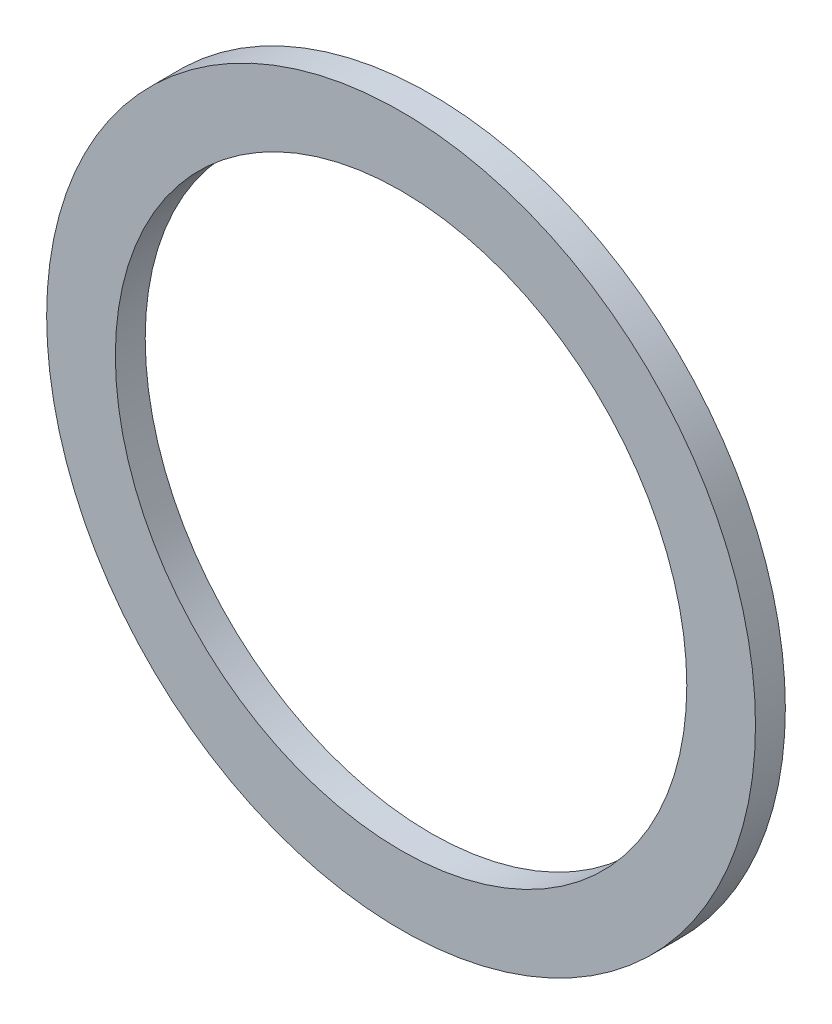
ISO-10303-21;
HEADER;
FILE_DESCRIPTION(('STEP AP214'),'2;1');
FILE_NAME('part.step','',(''),(''),'','','');
FILE_SCHEMA(('AUTOMOTIVE_DESIGN { 1 0 10303 214 1 1 1 1 }'));
ENDSEC;
DATA;
#1=APPLICATION_CONTEXT('core data for automotive mechanical design processes');
#2=APPLICATION_PROTOCOL_DEFINITION('international standard','automotive_design',2000,#1);
#3=PRODUCT_CONTEXT('',#1,'mechanical');
#4=PRODUCT('Part','Part','',(#3));
#5=PRODUCT_RELATED_PRODUCT_CATEGORY('part','',(#4));
#6=PRODUCT_DEFINITION_FORMATION('','',#4);
#7=PRODUCT_DEFINITION_CONTEXT('part definition',#1,'design');
#8=PRODUCT_DEFINITION('design','',#6,#7);
#9=PRODUCT_DEFINITION_SHAPE('','',#8);
#10=(LENGTH_UNIT() NAMED_UNIT(*) SI_UNIT(.MILLI.,.METRE.));
#11=(NAMED_UNIT(*) PLANE_ANGLE_UNIT() SI_UNIT($,.RADIAN.));
#12=(NAMED_UNIT(*) SI_UNIT($,.STERADIAN.) SOLID_ANGLE_UNIT());
#13=UNCERTAINTY_MEASURE_WITH_UNIT(LENGTH_MEASURE(1.E-05),#10,'distance_accuracy_value','');
#14=(GEOMETRIC_REPRESENTATION_CONTEXT(3) GLOBAL_UNCERTAINTY_ASSIGNED_CONTEXT((#13)) GLOBAL_UNIT_ASSIGNED_CONTEXT((#10,
#11,#12)) REPRESENTATION_CONTEXT('',''));
#15=CARTESIAN_POINT('',(0.,0.,0.));
#16=DIRECTION('',(0.,0.,1.));
#17=DIRECTION('',(1.,0.,0.));
#18=AXIS2_PLACEMENT_3D('',#15,#16,#17);
#19=CARTESIAN_POINT('',(0.,0.,0.));
#20=DIRECTION('',(0.,0.,1.));
#21=DIRECTION('',(1.,0.,0.));
#22=AXIS2_PLACEMENT_3D('',#19,#20,#21);
#23=CYLINDRICAL_SURFACE('',#22,14.35);
#24=DIRECTION('',(0.,0.,1.));
#25=VECTOR('',#24,1.);
#26=CARTESIAN_POINT('',(14.35,0.,0.));
#27=LINE('',#26,#25);
#28=CARTESIAN_POINT('',(14.35,0.,0.));
#29=VERTEX_POINT('',#28);
#30=CARTESIAN_POINT('',(14.35,0.,1.5));
#31=VERTEX_POINT('',#30);
#32=EDGE_CURVE('E9',#29,#31,#27,.T.);
#33=ORIENTED_EDGE('',*,*,#32,.F.);
#34=CARTESIAN_POINT('',(0.,0.,0.));
#35=DIRECTION('',(0.,0.,1.));
#36=DIRECTION('',(1.,0.,0.));
#37=AXIS2_PLACEMENT_3D('',#34,#35,#36);
#38=CIRCLE('',#37,14.35);
#39=EDGE_CURVE('E24',#29,#29,#38,.T.);
#40=ORIENTED_EDGE('',*,*,#39,.F.);
#41=ORIENTED_EDGE('',*,*,#32,.T.);
#42=CARTESIAN_POINT('',(0.,0.,1.5));
#43=DIRECTION('',(0.,0.,1.));
#44=DIRECTION('',(1.,0.,0.));
#45=AXIS2_PLACEMENT_3D('',#42,#43,#44);
#46=CIRCLE('',#45,14.35);
#47=EDGE_CURVE('E18',#31,#31,#46,.T.);
#48=ORIENTED_EDGE('',*,*,#47,.T.);
#49=EDGE_LOOP('',(#33,#40,#41,#48));
#50=FACE_BOUND('',#49,.T.);
#51=ADVANCED_FACE('F15',(#50),#23,.F.);
#52=CARTESIAN_POINT('',(0.,0.,0.));
#53=DIRECTION('',(0.,0.,1.));
#54=DIRECTION('',(1.,0.,0.));
#55=AXIS2_PLACEMENT_3D('',#52,#53,#54);
#56=PLANE('',#55);
#57=ORIENTED_EDGE('',*,*,#39,.T.);
#58=EDGE_LOOP('',(#57));
#59=FACE_BOUND('',#58,.T.);
#60=CARTESIAN_POINT('',(0.,0.,0.));
#61=DIRECTION('',(0.,0.,1.));
#62=DIRECTION('',(1.,0.,0.));
#63=AXIS2_PLACEMENT_3D('',#60,#61,#62);
#64=CIRCLE('',#63,17.8);
#65=CARTESIAN_POINT('',(17.8,0.,0.));
#66=VERTEX_POINT('',#65);
#67=EDGE_CURVE('E57',#66,#66,#64,.T.);
#68=ORIENTED_EDGE('',*,*,#67,.F.);
#69=EDGE_LOOP('',(#68));
#70=FACE_BOUND('',#69,.T.);
#71=ADVANCED_FACE('F72',(#59,#70),#56,.F.);
#72=CARTESIAN_POINT('',(0.,0.,1.5));
#73=DIRECTION('',(0.,0.,1.));
#74=DIRECTION('',(1.,0.,0.));
#75=AXIS2_PLACEMENT_3D('',#72,#73,#74);
#76=PLANE('',#75);
#77=ORIENTED_EDGE('',*,*,#47,.F.);
#78=EDGE_LOOP('',(#77));
#79=FACE_BOUND('',#78,.T.);
#80=CARTESIAN_POINT('',(0.,0.,1.5));
#81=DIRECTION('',(0.,0.,1.));
#82=DIRECTION('',(1.,0.,0.));
#83=AXIS2_PLACEMENT_3D('',#80,#81,#82);
#84=CIRCLE('',#83,17.8);
#85=CARTESIAN_POINT('',(17.8,0.,1.5));
#86=VERTEX_POINT('',#85);
#87=EDGE_CURVE('E53',#86,#86,#84,.T.);
#88=ORIENTED_EDGE('',*,*,#87,.T.);
#89=EDGE_LOOP('',(#88));
#90=FACE_BOUND('',#89,.T.);
#91=ADVANCED_FACE('F58',(#79,#90),#76,.T.);
#92=CARTESIAN_POINT('',(0.,0.,0.));
#93=DIRECTION('',(0.,0.,1.));
#94=DIRECTION('',(1.,0.,0.));
#95=AXIS2_PLACEMENT_3D('',#92,#93,#94);
#96=CYLINDRICAL_SURFACE('',#95,17.8);
#97=ORIENTED_EDGE('',*,*,#87,.F.);
#98=DIRECTION('',(0.,0.,1.));
#99=VECTOR('',#98,1.);
#100=CARTESIAN_POINT('',(17.8,0.,0.));
#101=LINE('',#100,#99);
#102=EDGE_CURVE('E51',#66,#86,#101,.T.);
#103=ORIENTED_EDGE('',*,*,#102,.F.);
#104=ORIENTED_EDGE('',*,*,#67,.T.);
#105=ORIENTED_EDGE('',*,*,#102,.T.);
#106=EDGE_LOOP('',(#97,#103,#104,#105));
#107=FACE_BOUND('',#106,.T.);
#108=ADVANCED_FACE('F52',(#107),#96,.T.);
#109=CLOSED_SHELL('',(#51,#71,#91,#108));
#110=MANIFOLD_SOLID_BREP('B1',#109);
#111=ADVANCED_BREP_SHAPE_REPRESENTATION('',(#18,#110),#14);
#112=SHAPE_DEFINITION_REPRESENTATION(#9,#111);
ENDSEC;
END-ISO-10303-21;
